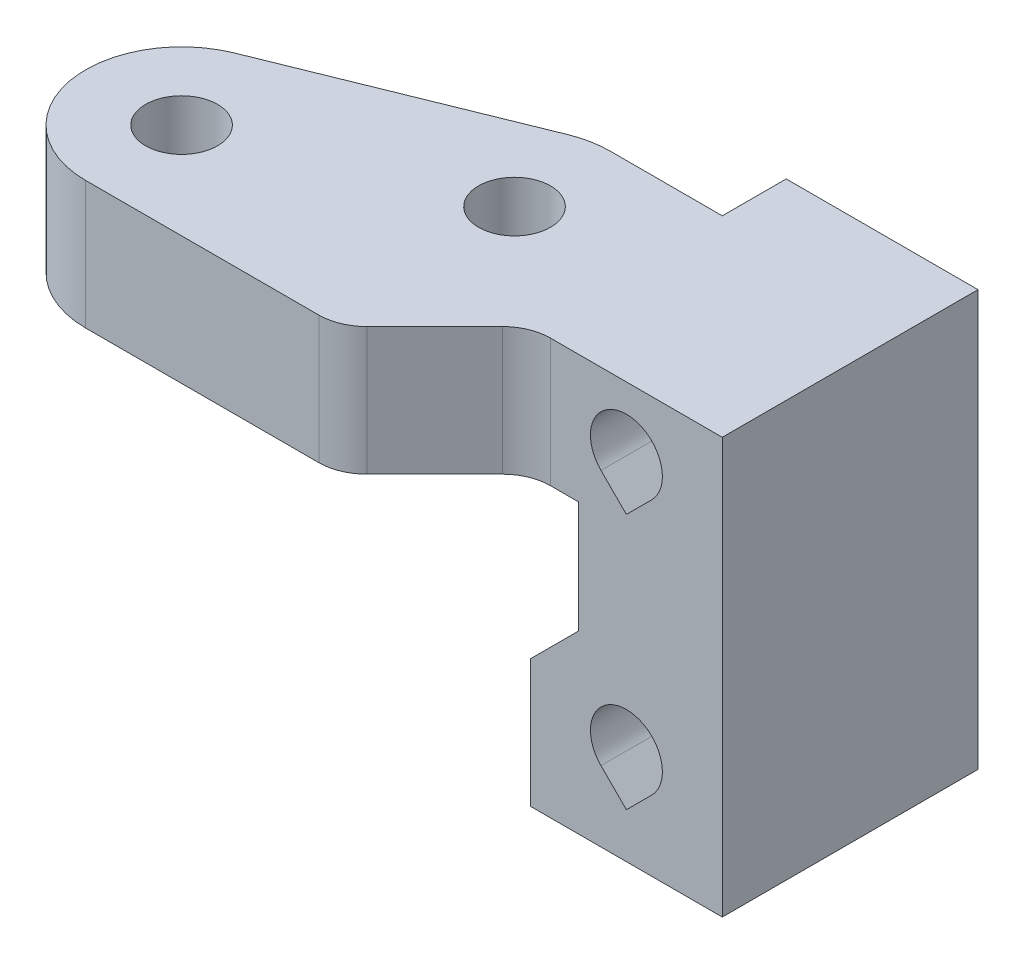
ISO-10303-21;
HEADER;
FILE_DESCRIPTION(('STEP AP214'),'2;1');
FILE_NAME('part.step','',(''),(''),'','','');
FILE_SCHEMA(('AUTOMOTIVE_DESIGN { 1 0 10303 214 1 1 1 1 }'));
ENDSEC;
DATA;
#1=APPLICATION_CONTEXT('core data for automotive mechanical design processes');
#2=APPLICATION_PROTOCOL_DEFINITION('international standard','automotive_design',2000,#1);
#3=PRODUCT_CONTEXT('',#1,'mechanical');
#4=PRODUCT('Part','Part','',(#3));
#5=PRODUCT_RELATED_PRODUCT_CATEGORY('part','',(#4));
#6=PRODUCT_DEFINITION_FORMATION('','',#4);
#7=PRODUCT_DEFINITION_CONTEXT('part definition',#1,'design');
#8=PRODUCT_DEFINITION('design','',#6,#7);
#9=PRODUCT_DEFINITION_SHAPE('','',#8);
#10=(LENGTH_UNIT() NAMED_UNIT(*) SI_UNIT(.MILLI.,.METRE.));
#11=(NAMED_UNIT(*) PLANE_ANGLE_UNIT() SI_UNIT($,.RADIAN.));
#12=(NAMED_UNIT(*) SI_UNIT($,.STERADIAN.) SOLID_ANGLE_UNIT());
#13=UNCERTAINTY_MEASURE_WITH_UNIT(LENGTH_MEASURE(1.E-05),#10,'distance_accuracy_value','');
#14=(GEOMETRIC_REPRESENTATION_CONTEXT(3) GLOBAL_UNCERTAINTY_ASSIGNED_CONTEXT((#13)) GLOBAL_UNIT_ASSIGNED_CONTEXT((#10,
#11,#12)) REPRESENTATION_CONTEXT('',''));
#15=CARTESIAN_POINT('',(0.,0.,0.));
#16=DIRECTION('',(0.,0.,1.));
#17=DIRECTION('',(1.,0.,0.));
#18=AXIS2_PLACEMENT_3D('',#15,#16,#17);
#19=CARTESIAN_POINT('',(-12.,8.,0.));
#20=DIRECTION('',(1.,0.,0.));
#21=DIRECTION('',(0.,0.,-1.));
#22=AXIS2_PLACEMENT_3D('',#19,#20,#21);
#23=PLANE('',#22);
#24=DIRECTION('',(0.,-1.,0.));
#25=VECTOR('',#24,1.);
#26=CARTESIAN_POINT('',(-12.,8.,0.));
#27=LINE('',#26,#25);
#28=CARTESIAN_POINT('',(-12.,8.,0.));
#29=VERTEX_POINT('',#28);
#30=CARTESIAN_POINT('',(-12.,0.,0.));
#31=VERTEX_POINT('',#30);
#32=EDGE_CURVE('E436',#29,#31,#27,.T.);
#33=ORIENTED_EDGE('',*,*,#32,.T.);
#34=DIRECTION('',(0.,0.,1.));
#35=VECTOR('',#34,1.);
#36=CARTESIAN_POINT('',(-12.,0.,0.));
#37=LINE('',#36,#35);
#38=CARTESIAN_POINT('',(-12.,0.,4.));
#39=VERTEX_POINT('',#38);
#40=EDGE_CURVE('E311',#31,#39,#37,.T.);
#41=ORIENTED_EDGE('',*,*,#40,.T.);
#42=DIRECTION('',(0.,-1.,0.));
#43=VECTOR('',#42,1.);
#44=CARTESIAN_POINT('',(-12.,8.,4.));
#45=LINE('',#44,#43);
#46=CARTESIAN_POINT('',(-12.,8.,4.));
#47=VERTEX_POINT('',#46);
#48=EDGE_CURVE('E245',#47,#39,#45,.T.);
#49=ORIENTED_EDGE('',*,*,#48,.F.);
#50=DIRECTION('',(0.,0.,1.));
#51=VECTOR('',#50,1.);
#52=CARTESIAN_POINT('',(-12.,8.,0.));
#53=LINE('',#52,#51);
#54=EDGE_CURVE('E213',#29,#47,#53,.T.);
#55=ORIENTED_EDGE('',*,*,#54,.F.);
#56=EDGE_LOOP('',(#33,#41,#49,#55));
#57=FACE_BOUND('',#56,.T.);
#58=ADVANCED_FACE('F32',(#57),#23,.F.);
#59=CARTESIAN_POINT('',(-19.,0.,10.));
#60=DIRECTION('',(0.,1.,0.));
#61=DIRECTION('',(0.,0.,1.));
#62=AXIS2_PLACEMENT_3D('',#59,#60,#61);
#63=PLANE('',#62);
#64=CARTESIAN_POINT('',(-33.8323969741913,0.,16.));
#65=DIRECTION('',(0.,1.,0.));
#66=DIRECTION('',(0.,0.,1.));
#67=AXIS2_PLACEMENT_3D('',#64,#65,#66);
#68=CIRCLE('',#67,2.25);
#69=CARTESIAN_POINT('',(-33.8323969741913,0.,18.25));
#70=VERTEX_POINT('',#69);
#71=EDGE_CURVE('E354',#70,#70,#68,.T.);
#72=ORIENTED_EDGE('',*,*,#71,.T.);
#73=EDGE_LOOP('',(#72));
#74=FACE_BOUND('',#73,.T.);
#75=CARTESIAN_POINT('',(-19.,0.,10.));
#76=DIRECTION('',(0.,1.,0.));
#77=DIRECTION('',(0.,0.,1.));
#78=AXIS2_PLACEMENT_3D('',#75,#76,#77);
#79=CIRCLE('',#78,2.25);
#80=CARTESIAN_POINT('',(-19.,0.,12.25));
#81=VERTEX_POINT('',#80);
#82=EDGE_CURVE('E218',#81,#81,#79,.T.);
#83=ORIENTED_EDGE('',*,*,#82,.T.);
#84=EDGE_LOOP('',(#83));
#85=FACE_BOUND('',#84,.T.);
#86=DIRECTION('',(0.707106781186549,0.,-0.707106781186546));
#87=VECTOR('',#86,1.);
#88=CARTESIAN_POINT('',(-12.,0.,16.));
#89=LINE('',#88,#87);
#90=CARTESIAN_POINT('',(-12.8786796564404,0.,16.8786796564404));
#91=VERTEX_POINT('',#90);
#92=CARTESIAN_POINT('',(-17.1213203435597,0.,21.1213203435596));
#93=VERTEX_POINT('',#92);
#94=EDGE_CURVE('E259',#91,#93,#89,.F.);
#95=ORIENTED_EDGE('',*,*,#94,.T.);
#96=CARTESIAN_POINT('',(-19.2426406871193,0.,19.));
#97=DIRECTION('',(0.,1.,0.));
#98=DIRECTION('',(0.,0.,1.));
#99=AXIS2_PLACEMENT_3D('',#96,#97,#98);
#100=CIRCLE('',#99,3.);
#101=CARTESIAN_POINT('',(-19.2426406871193,0.,22.));
#102=VERTEX_POINT('',#101);
#103=EDGE_CURVE('E55',#93,#102,#100,.F.);
#104=ORIENTED_EDGE('',*,*,#103,.T.);
#105=DIRECTION('',(1.,0.,0.));
#106=VECTOR('',#105,1.);
#107=CARTESIAN_POINT('',(-33.8323969741913,0.,22.));
#108=LINE('',#107,#106);
#109=CARTESIAN_POINT('',(-33.8323969741913,0.,22.));
#110=VERTEX_POINT('',#109);
#111=EDGE_CURVE('E211',#110,#102,#108,.T.);
#112=ORIENTED_EDGE('',*,*,#111,.F.);
#113=CARTESIAN_POINT('',(-33.8323969741913,0.,16.));
#114=DIRECTION('',(0.,1.,0.));
#115=DIRECTION('',(0.,0.,1.));
#116=AXIS2_PLACEMENT_3D('',#113,#114,#115);
#117=CIRCLE('',#116,6.);
#118=CARTESIAN_POINT('',(-36.0823969741913,0.,10.4378511346783));
#119=VERTEX_POINT('',#118);
#120=EDGE_CURVE('E215',#119,#110,#117,.T.);
#121=ORIENTED_EDGE('',*,*,#120,.F.);
#122=DIRECTION('',(-0.927024810886958,0.,0.375));
#123=VECTOR('',#122,1.);
#124=CARTESIAN_POINT('',(-21.25,0.,4.43785113467826));
#125=LINE('',#124,#123);
#126=CARTESIAN_POINT('',(-21.25,0.,4.43785113467825));
#127=VERTEX_POINT('',#126);
#128=EDGE_CURVE('E235',#127,#119,#125,.T.);
#129=ORIENTED_EDGE('',*,*,#128,.F.);
#130=CARTESIAN_POINT('',(-19.,0.,10.));
#131=DIRECTION('',(0.,1.,0.));
#132=DIRECTION('',(0.,0.,1.));
#133=AXIS2_PLACEMENT_3D('',#130,#131,#132);
#134=CIRCLE('',#133,6.);
#135=CARTESIAN_POINT('',(-19.,0.,4.));
#136=VERTEX_POINT('',#135);
#137=EDGE_CURVE('E233',#136,#127,#134,.T.);
#138=ORIENTED_EDGE('',*,*,#137,.F.);
#139=DIRECTION('',(-1.,0.,0.));
#140=VECTOR('',#139,1.);
#141=CARTESIAN_POINT('',(-12.,0.,4.));
#142=LINE('',#141,#140);
#143=EDGE_CURVE('E236',#39,#136,#142,.T.);
#144=ORIENTED_EDGE('',*,*,#143,.F.);
#145=ORIENTED_EDGE('',*,*,#40,.F.);
#146=DIRECTION('',(-1.,0.,0.));
#147=VECTOR('',#146,1.);
#148=CARTESIAN_POINT('',(-9.,0.,0.));
#149=LINE('',#148,#147);
#150=CARTESIAN_POINT('',(-9.,0.,0.));
#151=VERTEX_POINT('',#150);
#152=EDGE_CURVE('E296',#151,#31,#149,.T.);
#153=ORIENTED_EDGE('',*,*,#152,.F.);
#154=DIRECTION('',(0.,0.,1.));
#155=VECTOR('',#154,1.);
#156=CARTESIAN_POINT('',(-9.,0.,0.));
#157=LINE('',#156,#155);
#158=CARTESIAN_POINT('',(-9.,0.,16.));
#159=VERTEX_POINT('',#158);
#160=EDGE_CURVE('E291',#151,#159,#157,.T.);
#161=ORIENTED_EDGE('',*,*,#160,.T.);
#162=DIRECTION('',(-1.,0.,0.));
#163=VECTOR('',#162,1.);
#164=CARTESIAN_POINT('',(-19.,0.,16.));
#165=LINE('',#164,#163);
#166=CARTESIAN_POINT('',(-10.7573593128807,0.,16.));
#167=VERTEX_POINT('',#166);
#168=EDGE_CURVE('E276',#159,#167,#165,.T.);
#169=ORIENTED_EDGE('',*,*,#168,.T.);
#170=CARTESIAN_POINT('',(-10.7573593128807,0.,19.));
#171=DIRECTION('',(0.,1.,0.));
#172=DIRECTION('',(0.,0.,1.));
#173=AXIS2_PLACEMENT_3D('',#170,#171,#172);
#174=CIRCLE('',#173,3.);
#175=EDGE_CURVE('E40',#167,#91,#174,.T.);
#176=ORIENTED_EDGE('',*,*,#175,.T.);
#177=EDGE_LOOP('',(#95,#104,#112,#121,#129,#138,#144,#145,#153,#161,#169,#176));
#178=FACE_BOUND('',#177,.T.);
#179=ADVANCED_FACE('F274',(#74,#85,#178),#63,.F.);
#180=CARTESIAN_POINT('',(-19.,8.,10.));
#181=DIRECTION('',(0.,1.,0.));
#182=DIRECTION('',(0.,0.,1.));
#183=AXIS2_PLACEMENT_3D('',#180,#181,#182);
#184=PLANE('',#183);
#185=DIRECTION('',(1.,0.,0.));
#186=VECTOR('',#185,1.);
#187=CARTESIAN_POINT('',(-33.8323969741913,8.,22.));
#188=LINE('',#187,#186);
#189=CARTESIAN_POINT('',(-33.8323969741913,8.,22.));
#190=VERTEX_POINT('',#189);
#191=CARTESIAN_POINT('',(-19.2426406871193,8.,22.));
#192=VERTEX_POINT('',#191);
#193=EDGE_CURVE('E230',#190,#192,#188,.T.);
#194=ORIENTED_EDGE('',*,*,#193,.T.);
#195=CARTESIAN_POINT('',(-19.2426406871193,8.,19.));
#196=DIRECTION('',(0.,1.,0.));
#197=DIRECTION('',(0.,0.,1.));
#198=AXIS2_PLACEMENT_3D('',#195,#196,#197);
#199=CIRCLE('',#198,3.);
#200=CARTESIAN_POINT('',(-17.1213203435597,8.,21.1213203435596));
#201=VERTEX_POINT('',#200);
#202=EDGE_CURVE('E47',#192,#201,#199,.T.);
#203=ORIENTED_EDGE('',*,*,#202,.T.);
#204=DIRECTION('',(-0.707106781186549,0.,0.707106781186546));
#205=VECTOR('',#204,1.);
#206=CARTESIAN_POINT('',(-12.5,8.,16.5));
#207=LINE('',#206,#205);
#208=CARTESIAN_POINT('',(-12.8786796564404,8.,16.8786796564404));
#209=VERTEX_POINT('',#208);
#210=EDGE_CURVE('E261',#201,#209,#207,.F.);
#211=ORIENTED_EDGE('',*,*,#210,.T.);
#212=CARTESIAN_POINT('',(-10.7573593128807,8.,19.));
#213=DIRECTION('',(0.,1.,0.));
#214=DIRECTION('',(0.,0.,1.));
#215=AXIS2_PLACEMENT_3D('',#212,#213,#214);
#216=CIRCLE('',#215,3.);
#217=CARTESIAN_POINT('',(-10.7573593128807,8.,16.));
#218=VERTEX_POINT('',#217);
#219=EDGE_CURVE('E11',#209,#218,#216,.F.);
#220=ORIENTED_EDGE('',*,*,#219,.T.);
#221=DIRECTION('',(-1.,0.,0.));
#222=VECTOR('',#221,1.);
#223=CARTESIAN_POINT('',(0.,8.,16.));
#224=LINE('',#223,#222);
#225=CARTESIAN_POINT('',(0.,8.,16.));
#226=VERTEX_POINT('',#225);
#227=EDGE_CURVE('E188',#226,#218,#224,.T.);
#228=ORIENTED_EDGE('',*,*,#227,.F.);
#229=DIRECTION('',(0.,0.,-1.));
#230=VECTOR('',#229,1.);
#231=CARTESIAN_POINT('',(0.,8.,22.));
#232=LINE('',#231,#230);
#233=CARTESIAN_POINT('',(0.,8.,0.));
#234=VERTEX_POINT('',#233);
#235=EDGE_CURVE('E201',#226,#234,#232,.T.);
#236=ORIENTED_EDGE('',*,*,#235,.T.);
#237=DIRECTION('',(-1.,0.,0.));
#238=VECTOR('',#237,1.);
#239=CARTESIAN_POINT('',(0.,8.,0.));
#240=LINE('',#239,#238);
#241=EDGE_CURVE('E210',#234,#29,#240,.T.);
#242=ORIENTED_EDGE('',*,*,#241,.T.);
#243=ORIENTED_EDGE('',*,*,#54,.T.);
#244=DIRECTION('',(-1.,0.,0.));
#245=VECTOR('',#244,1.);
#246=CARTESIAN_POINT('',(-12.,8.,4.));
#247=LINE('',#246,#245);
#248=CARTESIAN_POINT('',(-19.,8.,4.));
#249=VERTEX_POINT('',#248);
#250=EDGE_CURVE('E222',#47,#249,#247,.T.);
#251=ORIENTED_EDGE('',*,*,#250,.T.);
#252=CARTESIAN_POINT('',(-19.,8.,10.));
#253=DIRECTION('',(0.,1.,0.));
#254=DIRECTION('',(0.,0.,1.));
#255=AXIS2_PLACEMENT_3D('',#252,#253,#254);
#256=CIRCLE('',#255,6.);
#257=CARTESIAN_POINT('',(-21.25,8.,4.43785113467825));
#258=VERTEX_POINT('',#257);
#259=EDGE_CURVE('E224',#249,#258,#256,.T.);
#260=ORIENTED_EDGE('',*,*,#259,.T.);
#261=DIRECTION('',(-0.927024810886958,0.,0.375));
#262=VECTOR('',#261,1.);
#263=CARTESIAN_POINT('',(-21.25,8.,4.43785113467826));
#264=LINE('',#263,#262);
#265=CARTESIAN_POINT('',(-36.0823969741913,8.,10.4378511346783));
#266=VERTEX_POINT('',#265);
#267=EDGE_CURVE('E226',#258,#266,#264,.T.);
#268=ORIENTED_EDGE('',*,*,#267,.T.);
#269=CARTESIAN_POINT('',(-33.8323969741913,8.,16.));
#270=DIRECTION('',(0.,1.,0.));
#271=DIRECTION('',(0.,0.,1.));
#272=AXIS2_PLACEMENT_3D('',#269,#270,#271);
#273=CIRCLE('',#272,6.);
#274=EDGE_CURVE('E228',#266,#190,#273,.T.);
#275=ORIENTED_EDGE('',*,*,#274,.T.);
#276=EDGE_LOOP('',(#194,#203,#211,#220,#228,#236,#242,#243,#251,#260,#268,#275));
#277=FACE_BOUND('',#276,.T.);
#278=CARTESIAN_POINT('',(-19.,8.,10.));
#279=DIRECTION('',(0.,1.,0.));
#280=DIRECTION('',(0.,0.,1.));
#281=AXIS2_PLACEMENT_3D('',#278,#279,#280);
#282=CIRCLE('',#281,2.25);
#283=CARTESIAN_POINT('',(-19.,8.,12.25));
#284=VERTEX_POINT('',#283);
#285=EDGE_CURVE('E253',#284,#284,#282,.T.);
#286=ORIENTED_EDGE('',*,*,#285,.F.);
#287=EDGE_LOOP('',(#286));
#288=FACE_BOUND('',#287,.T.);
#289=CARTESIAN_POINT('',(-33.8323969741913,8.,16.));
#290=DIRECTION('',(0.,1.,0.));
#291=DIRECTION('',(0.,0.,1.));
#292=AXIS2_PLACEMENT_3D('',#289,#290,#291);
#293=CIRCLE('',#292,2.25);
#294=CARTESIAN_POINT('',(-33.8323969741913,8.,18.25));
#295=VERTEX_POINT('',#294);
#296=EDGE_CURVE('E355',#295,#295,#293,.T.);
#297=ORIENTED_EDGE('',*,*,#296,.F.);
#298=EDGE_LOOP('',(#297));
#299=FACE_BOUND('',#298,.T.);
#300=ADVANCED_FACE('F199',(#277,#288,#299),#184,.T.);
#301=CARTESIAN_POINT('',(0.,8.,22.));
#302=DIRECTION('',(-1.,0.,0.));
#303=DIRECTION('',(0.,0.,1.));
#304=AXIS2_PLACEMENT_3D('',#301,#302,#303);
#305=PLANE('',#304);
#306=ORIENTED_EDGE('',*,*,#235,.F.);
#307=DIRECTION('',(0.,1.,0.));
#308=VECTOR('',#307,1.);
#309=CARTESIAN_POINT('',(0.,8.,16.));
#310=LINE('',#309,#308);
#311=CARTESIAN_POINT('',(0.,-18.,16.));
#312=VERTEX_POINT('',#311);
#313=EDGE_CURVE('E183',#312,#226,#310,.T.);
#314=ORIENTED_EDGE('',*,*,#313,.F.);
#315=DIRECTION('',(0.,0.,1.));
#316=VECTOR('',#315,1.);
#317=CARTESIAN_POINT('',(0.,-18.,0.));
#318=LINE('',#317,#316);
#319=CARTESIAN_POINT('',(0.,-18.,0.));
#320=VERTEX_POINT('',#319);
#321=EDGE_CURVE('E352',#320,#312,#318,.T.);
#322=ORIENTED_EDGE('',*,*,#321,.F.);
#323=DIRECTION('',(0.,-1.,0.));
#324=VECTOR('',#323,1.);
#325=CARTESIAN_POINT('',(0.,8.,0.));
#326=LINE('',#325,#324);
#327=EDGE_CURVE('E209',#234,#320,#326,.T.);
#328=ORIENTED_EDGE('',*,*,#327,.F.);
#329=EDGE_LOOP('',(#306,#314,#322,#328));
#330=FACE_BOUND('',#329,.T.);
#331=ADVANCED_FACE('F208',(#330),#305,.F.);
#332=CARTESIAN_POINT('',(0.,8.,0.));
#333=DIRECTION('',(0.,0.,1.));
#334=DIRECTION('',(1.,0.,0.));
#335=AXIS2_PLACEMENT_3D('',#332,#333,#334);
#336=PLANE('',#335);
#337=DIRECTION('',(0.707106781186548,0.707106781186547,0.));
#338=VECTOR('',#337,1.);
#339=CARTESIAN_POINT('',(-6.,-15.1819805153395,0.));
#340=LINE('',#339,#338);
#341=CARTESIAN_POINT('',(-6.,-15.1819805153395,0.));
#342=VERTEX_POINT('',#341);
#343=CARTESIAN_POINT('',(-4.40900974233027,-13.5909902576697,0.));
#344=VERTEX_POINT('',#343);
#345=EDGE_CURVE('E317',#342,#344,#340,.T.);
#346=ORIENTED_EDGE('',*,*,#345,.T.);
#347=CARTESIAN_POINT('',(-6.,-12.,0.));
#348=DIRECTION('',(0.,0.,1.));
#349=DIRECTION('',(1.,0.,0.));
#350=AXIS2_PLACEMENT_3D('',#347,#348,#349);
#351=CIRCLE('',#350,2.25);
#352=CARTESIAN_POINT('',(-7.59099025766974,-13.5909902576697,0.));
#353=VERTEX_POINT('',#352);
#354=EDGE_CURVE('E298',#344,#353,#351,.T.);
#355=ORIENTED_EDGE('',*,*,#354,.T.);
#356=DIRECTION('',(0.707106781186548,-0.707106781186547,0.));
#357=VECTOR('',#356,1.);
#358=CARTESIAN_POINT('',(-7.59099025766974,-13.5909902576697,0.));
#359=LINE('',#358,#357);
#360=EDGE_CURVE('E301',#353,#342,#359,.T.);
#361=ORIENTED_EDGE('',*,*,#360,.T.);
#362=EDGE_LOOP('',(#346,#355,#361));
#363=FACE_BOUND('',#362,.T.);
#364=DIRECTION('',(0.707106781186547,0.707106781186548,0.));
#365=VECTOR('',#364,1.);
#366=CARTESIAN_POINT('',(-6.,0.818019484660536,0.));
#367=LINE('',#366,#365);
#368=CARTESIAN_POINT('',(-6.,0.818019484660536,0.));
#369=VERTEX_POINT('',#368);
#370=CARTESIAN_POINT('',(-4.40900974233027,2.40900974233027,0.));
#371=VERTEX_POINT('',#370);
#372=EDGE_CURVE('E335',#369,#371,#367,.T.);
#373=ORIENTED_EDGE('',*,*,#372,.T.);
#374=CARTESIAN_POINT('',(-6.,4.,0.));
#375=DIRECTION('',(0.,0.,1.));
#376=DIRECTION('',(1.,0.,0.));
#377=AXIS2_PLACEMENT_3D('',#374,#375,#376);
#378=CIRCLE('',#377,2.25);
#379=CARTESIAN_POINT('',(-7.59099025766973,2.40900974233027,0.));
#380=VERTEX_POINT('',#379);
#381=EDGE_CURVE('E324',#371,#380,#378,.T.);
#382=ORIENTED_EDGE('',*,*,#381,.T.);
#383=DIRECTION('',(0.707106781186548,-0.707106781186547,0.));
#384=VECTOR('',#383,1.);
#385=CARTESIAN_POINT('',(-7.59099025766973,2.40900974233027,0.));
#386=LINE('',#385,#384);
#387=EDGE_CURVE('E332',#380,#369,#386,.T.);
#388=ORIENTED_EDGE('',*,*,#387,.T.);
#389=EDGE_LOOP('',(#373,#382,#388));
#390=FACE_BOUND('',#389,.T.);
#391=DIRECTION('',(0.,1.,0.));
#392=VECTOR('',#391,1.);
#393=CARTESIAN_POINT('',(-9.,-6.99999999999997,0.));
#394=LINE('',#393,#392);
#395=CARTESIAN_POINT('',(-9.,-6.99999999999997,0.));
#396=VERTEX_POINT('',#395);
#397=EDGE_CURVE('E306',#396,#151,#394,.T.);
#398=ORIENTED_EDGE('',*,*,#397,.T.);
#399=ORIENTED_EDGE('',*,*,#152,.T.);
#400=ORIENTED_EDGE('',*,*,#32,.F.);
#401=ORIENTED_EDGE('',*,*,#241,.F.);
#402=ORIENTED_EDGE('',*,*,#327,.T.);
#403=DIRECTION('',(1.,0.,0.));
#404=VECTOR('',#403,1.);
#405=CARTESIAN_POINT('',(-12.,-18.,0.));
#406=LINE('',#405,#404);
#407=CARTESIAN_POINT('',(-12.,-18.,0.));
#408=VERTEX_POINT('',#407);
#409=EDGE_CURVE('E349',#408,#320,#406,.T.);
#410=ORIENTED_EDGE('',*,*,#409,.F.);
#411=CARTESIAN_POINT('',(-12.,-10.,0.));
#412=VERTEX_POINT('',#411);
#413=EDGE_CURVE('E248',#412,#408,#27,.T.);
#414=ORIENTED_EDGE('',*,*,#413,.F.);
#415=DIRECTION('',(0.707106781186543,0.707106781186552,0.));
#416=VECTOR('',#415,1.);
#417=CARTESIAN_POINT('',(-12.,-10.,0.));
#418=LINE('',#417,#416);
#419=EDGE_CURVE('E432',#412,#396,#418,.T.);
#420=ORIENTED_EDGE('',*,*,#419,.T.);
#421=EDGE_LOOP('',(#398,#399,#400,#401,#402,#410,#414,#420));
#422=FACE_BOUND('',#421,.T.);
#423=ADVANCED_FACE('F396',(#363,#390,#422),#336,.F.);
#424=DIRECTION('',(0.,0.,-1.));
#425=VECTOR('',#424,1.);
#426=CARTESIAN_POINT('',(-12.,-18.,0.));
#427=LINE('',#426,#425);
#428=CARTESIAN_POINT('',(-12.,-18.,16.));
#429=VERTEX_POINT('',#428);
#430=EDGE_CURVE('E342',#429,#408,#427,.T.);
#431=ORIENTED_EDGE('',*,*,#430,.F.);
#432=DIRECTION('',(0.,-1.,0.));
#433=VECTOR('',#432,1.);
#434=CARTESIAN_POINT('',(-12.,8.,16.));
#435=LINE('',#434,#433);
#436=CARTESIAN_POINT('',(-12.,-10.,16.));
#437=VERTEX_POINT('',#436);
#438=EDGE_CURVE('E205',#437,#429,#435,.T.);
#439=ORIENTED_EDGE('',*,*,#438,.F.);
#440=DIRECTION('',(0.,0.,1.));
#441=VECTOR('',#440,1.);
#442=CARTESIAN_POINT('',(-12.,-10.,0.));
#443=LINE('',#442,#441);
#444=EDGE_CURVE('E303',#412,#437,#443,.T.);
#445=ORIENTED_EDGE('',*,*,#444,.F.);
#446=ORIENTED_EDGE('',*,*,#413,.T.);
#447=EDGE_LOOP('',(#431,#439,#445,#446));
#448=FACE_BOUND('',#447,.T.);
#449=ADVANCED_FACE('F385',(#448),#23,.F.);
#450=CARTESIAN_POINT('',(-12.,8.,4.));
#451=DIRECTION('',(0.,0.,1.));
#452=DIRECTION('',(1.,0.,0.));
#453=AXIS2_PLACEMENT_3D('',#450,#451,#452);
#454=PLANE('',#453);
#455=ORIENTED_EDGE('',*,*,#143,.T.);
#456=DIRECTION('',(0.,-1.,0.));
#457=VECTOR('',#456,1.);
#458=CARTESIAN_POINT('',(-19.,8.,4.));
#459=LINE('',#458,#457);
#460=EDGE_CURVE('E249',#249,#136,#459,.T.);
#461=ORIENTED_EDGE('',*,*,#460,.F.);
#462=ORIENTED_EDGE('',*,*,#250,.F.);
#463=ORIENTED_EDGE('',*,*,#48,.T.);
#464=EDGE_LOOP('',(#455,#461,#462,#463));
#465=FACE_BOUND('',#464,.T.);
#466=ADVANCED_FACE('F395',(#465),#454,.F.);
#467=CARTESIAN_POINT('',(-19.,8.,10.));
#468=DIRECTION('',(0.,-1.,0.));
#469=DIRECTION('',(0.,0.,-1.));
#470=AXIS2_PLACEMENT_3D('',#467,#468,#469);
#471=CYLINDRICAL_SURFACE('',#470,6.);
#472=ORIENTED_EDGE('',*,*,#137,.T.);
#473=DIRECTION('',(0.,-1.,0.));
#474=VECTOR('',#473,1.);
#475=CARTESIAN_POINT('',(-21.25,8.,4.43785113467825));
#476=LINE('',#475,#474);
#477=EDGE_CURVE('E442',#258,#127,#476,.T.);
#478=ORIENTED_EDGE('',*,*,#477,.F.);
#479=ORIENTED_EDGE('',*,*,#259,.F.);
#480=ORIENTED_EDGE('',*,*,#460,.T.);
#481=EDGE_LOOP('',(#472,#478,#479,#480));
#482=FACE_BOUND('',#481,.T.);
#483=ADVANCED_FACE('F402',(#482),#471,.T.);
#484=CARTESIAN_POINT('',(-21.25,8.,4.43785113467826));
#485=DIRECTION('',(0.375,0.,0.927024810886958));
#486=DIRECTION('',(0.927024810886958,0.,-0.375));
#487=AXIS2_PLACEMENT_3D('',#484,#485,#486);
#488=PLANE('',#487);
#489=ORIENTED_EDGE('',*,*,#128,.T.);
#490=DIRECTION('',(0.,-1.,0.));
#491=VECTOR('',#490,1.);
#492=CARTESIAN_POINT('',(-36.0823969741913,8.,10.4378511346783));
#493=LINE('',#492,#491);
#494=EDGE_CURVE('E444',#266,#119,#493,.T.);
#495=ORIENTED_EDGE('',*,*,#494,.F.);
#496=ORIENTED_EDGE('',*,*,#267,.F.);
#497=ORIENTED_EDGE('',*,*,#477,.T.);
#498=EDGE_LOOP('',(#489,#495,#496,#497));
#499=FACE_BOUND('',#498,.T.);
#500=ADVANCED_FACE('F456',(#499),#488,.F.);
#501=CARTESIAN_POINT('',(-33.8323969741913,8.,16.));
#502=DIRECTION('',(0.,-1.,0.));
#503=DIRECTION('',(0.,0.,-1.));
#504=AXIS2_PLACEMENT_3D('',#501,#502,#503);
#505=CYLINDRICAL_SURFACE('',#504,6.);
#506=ORIENTED_EDGE('',*,*,#120,.T.);
#507=DIRECTION('',(0.,-1.,0.));
#508=VECTOR('',#507,1.);
#509=CARTESIAN_POINT('',(-33.8323969741913,8.,22.));
#510=LINE('',#509,#508);
#511=EDGE_CURVE('E232',#190,#110,#510,.T.);
#512=ORIENTED_EDGE('',*,*,#511,.F.);
#513=ORIENTED_EDGE('',*,*,#274,.F.);
#514=ORIENTED_EDGE('',*,*,#494,.T.);
#515=EDGE_LOOP('',(#506,#512,#513,#514));
#516=FACE_BOUND('',#515,.T.);
#517=ADVANCED_FACE('F378',(#516),#505,.T.);
#518=CARTESIAN_POINT('',(-33.8323969741913,8.,22.));
#519=DIRECTION('',(0.,0.,-1.));
#520=DIRECTION('',(-1.,0.,0.));
#521=AXIS2_PLACEMENT_3D('',#518,#519,#520);
#522=PLANE('',#521);
#523=ORIENTED_EDGE('',*,*,#111,.T.);
#524=DIRECTION('',(0.,-1.,0.));
#525=VECTOR('',#524,1.);
#526=CARTESIAN_POINT('',(-19.2426406871193,8.,22.));
#527=LINE('',#526,#525);
#528=EDGE_CURVE('E269',#102,#192,#527,.F.);
#529=ORIENTED_EDGE('',*,*,#528,.T.);
#530=ORIENTED_EDGE('',*,*,#193,.F.);
#531=ORIENTED_EDGE('',*,*,#511,.T.);
#532=EDGE_LOOP('',(#523,#529,#530,#531));
#533=FACE_BOUND('',#532,.T.);
#534=ADVANCED_FACE('F369',(#533),#522,.F.);
#535=CARTESIAN_POINT('',(-19.,8.,10.));
#536=DIRECTION('',(0.,-1.,0.));
#537=DIRECTION('',(0.,0.,-1.));
#538=AXIS2_PLACEMENT_3D('',#535,#536,#537);
#539=CYLINDRICAL_SURFACE('',#538,2.25);
#540=ORIENTED_EDGE('',*,*,#285,.T.);
#541=EDGE_LOOP('',(#540));
#542=FACE_BOUND('',#541,.T.);
#543=ORIENTED_EDGE('',*,*,#82,.F.);
#544=EDGE_LOOP('',(#543));
#545=FACE_BOUND('',#544,.T.);
#546=ADVANCED_FACE('F366',(#542,#545),#539,.F.);
#547=CARTESIAN_POINT('',(-33.8323969741913,8.,16.));
#548=DIRECTION('',(0.,-1.,0.));
#549=DIRECTION('',(0.,0.,-1.));
#550=AXIS2_PLACEMENT_3D('',#547,#548,#549);
#551=CYLINDRICAL_SURFACE('',#550,2.25);
#552=ORIENTED_EDGE('',*,*,#296,.T.);
#553=EDGE_LOOP('',(#552));
#554=FACE_BOUND('',#553,.T.);
#555=ORIENTED_EDGE('',*,*,#71,.F.);
#556=EDGE_LOOP('',(#555));
#557=FACE_BOUND('',#556,.T.);
#558=ADVANCED_FACE('F368',(#554,#557),#551,.F.);
#559=CARTESIAN_POINT('',(0.,-18.,0.));
#560=DIRECTION('',(0.,1.,0.));
#561=DIRECTION('',(0.,0.,1.));
#562=AXIS2_PLACEMENT_3D('',#559,#560,#561);
#563=PLANE('',#562);
#564=ORIENTED_EDGE('',*,*,#321,.T.);
#565=DIRECTION('',(1.,0.,0.));
#566=VECTOR('',#565,1.);
#567=CARTESIAN_POINT('',(0.,-18.,16.));
#568=LINE('',#567,#566);
#569=EDGE_CURVE('E191',#429,#312,#568,.T.);
#570=ORIENTED_EDGE('',*,*,#569,.F.);
#571=ORIENTED_EDGE('',*,*,#430,.T.);
#572=ORIENTED_EDGE('',*,*,#409,.T.);
#573=EDGE_LOOP('',(#564,#570,#571,#572));
#574=FACE_BOUND('',#573,.T.);
#575=ADVANCED_FACE('F375',(#574),#563,.F.);
#576=CARTESIAN_POINT('',(-6.,4.,0.));
#577=DIRECTION('',(0.,0.,1.));
#578=DIRECTION('',(1.,0.,0.));
#579=AXIS2_PLACEMENT_3D('',#576,#577,#578);
#580=CYLINDRICAL_SURFACE('',#579,2.25);
#581=DIRECTION('',(0.,0.,1.));
#582=VECTOR('',#581,1.);
#583=CARTESIAN_POINT('',(-4.40900974233027,2.40900974233027,0.));
#584=LINE('',#583,#582);
#585=CARTESIAN_POINT('',(-4.40900974233027,2.40900974233027,16.));
#586=VERTEX_POINT('',#585);
#587=EDGE_CURVE('E339',#371,#586,#584,.T.);
#588=ORIENTED_EDGE('',*,*,#587,.T.);
#589=CARTESIAN_POINT('',(-6.,4.,16.));
#590=DIRECTION('',(0.,0.,-1.));
#591=DIRECTION('',(-1.,0.,0.));
#592=AXIS2_PLACEMENT_3D('',#589,#590,#591);
#593=CIRCLE('',#592,2.25);
#594=CARTESIAN_POINT('',(-7.59099025766973,2.40900974233027,16.));
#595=VERTEX_POINT('',#594);
#596=EDGE_CURVE('E429',#586,#595,#593,.F.);
#597=ORIENTED_EDGE('',*,*,#596,.T.);
#598=DIRECTION('',(0.,0.,1.));
#599=VECTOR('',#598,1.);
#600=CARTESIAN_POINT('',(-7.59099025766973,2.40900974233027,0.));
#601=LINE('',#600,#599);
#602=EDGE_CURVE('E338',#380,#595,#601,.T.);
#603=ORIENTED_EDGE('',*,*,#602,.F.);
#604=ORIENTED_EDGE('',*,*,#381,.F.);
#605=EDGE_LOOP('',(#588,#597,#603,#604));
#606=FACE_BOUND('',#605,.T.);
#607=ADVANCED_FACE('F567',(#606),#580,.F.);
#608=CARTESIAN_POINT('',(-6.,0.818019484660536,0.));
#609=DIRECTION('',(0.707106781186548,-0.707106781186547,0.));
#610=DIRECTION('',(0.707106781186547,0.707106781186548,0.));
#611=AXIS2_PLACEMENT_3D('',#608,#609,#610);
#612=PLANE('',#611);
#613=DIRECTION('',(0.,0.,1.));
#614=VECTOR('',#613,1.);
#615=CARTESIAN_POINT('',(-6.,0.818019484660536,0.));
#616=LINE('',#615,#614);
#617=CARTESIAN_POINT('',(-6.,0.818019484660536,16.));
#618=VERTEX_POINT('',#617);
#619=EDGE_CURVE('E343',#369,#618,#616,.T.);
#620=ORIENTED_EDGE('',*,*,#619,.T.);
#621=DIRECTION('',(0.707106781186547,0.707106781186548,0.));
#622=VECTOR('',#621,1.);
#623=CARTESIAN_POINT('',(-6.,0.818019484660536,16.));
#624=LINE('',#623,#622);
#625=EDGE_CURVE('E426',#618,#586,#624,.T.);
#626=ORIENTED_EDGE('',*,*,#625,.T.);
#627=ORIENTED_EDGE('',*,*,#587,.F.);
#628=ORIENTED_EDGE('',*,*,#372,.F.);
#629=EDGE_LOOP('',(#620,#626,#627,#628));
#630=FACE_BOUND('',#629,.T.);
#631=ADVANCED_FACE('F557',(#630),#612,.F.);
#632=CARTESIAN_POINT('',(-7.59099025766973,2.40900974233027,0.));
#633=DIRECTION('',(-0.707106781186547,-0.707106781186548,0.));
#634=DIRECTION('',(0.707106781186548,-0.707106781186547,0.));
#635=AXIS2_PLACEMENT_3D('',#632,#633,#634);
#636=PLANE('',#635);
#637=ORIENTED_EDGE('',*,*,#602,.T.);
#638=DIRECTION('',(0.707106781186548,-0.707106781186547,0.));
#639=VECTOR('',#638,1.);
#640=CARTESIAN_POINT('',(-7.59099025766973,2.40900974233027,16.));
#641=LINE('',#640,#639);
#642=EDGE_CURVE('E423',#595,#618,#641,.T.);
#643=ORIENTED_EDGE('',*,*,#642,.T.);
#644=ORIENTED_EDGE('',*,*,#619,.F.);
#645=ORIENTED_EDGE('',*,*,#387,.F.);
#646=EDGE_LOOP('',(#637,#643,#644,#645));
#647=FACE_BOUND('',#646,.T.);
#648=ADVANCED_FACE('F547',(#647),#636,.F.);
#649=CARTESIAN_POINT('',(-6.,-12.,0.));
#650=DIRECTION('',(0.,0.,1.));
#651=DIRECTION('',(1.,0.,0.));
#652=AXIS2_PLACEMENT_3D('',#649,#650,#651);
#653=CYLINDRICAL_SURFACE('',#652,2.25);
#654=DIRECTION('',(0.,0.,1.));
#655=VECTOR('',#654,1.);
#656=CARTESIAN_POINT('',(-4.40900974233027,-13.5909902576697,0.));
#657=LINE('',#656,#655);
#658=CARTESIAN_POINT('',(-4.40900974233027,-13.5909902576697,16.));
#659=VERTEX_POINT('',#658);
#660=EDGE_CURVE('E321',#344,#659,#657,.T.);
#661=ORIENTED_EDGE('',*,*,#660,.T.);
#662=CARTESIAN_POINT('',(-6.,-12.,16.));
#663=DIRECTION('',(0.,0.,-1.));
#664=DIRECTION('',(-1.,0.,0.));
#665=AXIS2_PLACEMENT_3D('',#662,#663,#664);
#666=CIRCLE('',#665,2.25);
#667=CARTESIAN_POINT('',(-7.59099025766974,-13.5909902576697,16.));
#668=VERTEX_POINT('',#667);
#669=EDGE_CURVE('E420',#659,#668,#666,.F.);
#670=ORIENTED_EDGE('',*,*,#669,.T.);
#671=DIRECTION('',(0.,0.,1.));
#672=VECTOR('',#671,1.);
#673=CARTESIAN_POINT('',(-7.59099025766974,-13.5909902576697,0.));
#674=LINE('',#673,#672);
#675=EDGE_CURVE('E320',#353,#668,#674,.T.);
#676=ORIENTED_EDGE('',*,*,#675,.F.);
#677=ORIENTED_EDGE('',*,*,#354,.F.);
#678=EDGE_LOOP('',(#661,#670,#676,#677));
#679=FACE_BOUND('',#678,.T.);
#680=ADVANCED_FACE('F537',(#679),#653,.F.);
#681=CARTESIAN_POINT('',(-6.,-15.1819805153395,0.));
#682=DIRECTION('',(0.707106781186547,-0.707106781186548,0.));
#683=DIRECTION('',(0.707106781186548,0.707106781186547,0.));
#684=AXIS2_PLACEMENT_3D('',#681,#682,#683);
#685=PLANE('',#684);
#686=DIRECTION('',(0.,0.,1.));
#687=VECTOR('',#686,1.);
#688=CARTESIAN_POINT('',(-6.,-15.1819805153395,0.));
#689=LINE('',#688,#687);
#690=CARTESIAN_POINT('',(-6.,-15.1819805153395,16.));
#691=VERTEX_POINT('',#690);
#692=EDGE_CURVE('E325',#342,#691,#689,.T.);
#693=ORIENTED_EDGE('',*,*,#692,.T.);
#694=DIRECTION('',(0.707106781186548,0.707106781186547,0.));
#695=VECTOR('',#694,1.);
#696=CARTESIAN_POINT('',(-6.,-15.1819805153395,16.));
#697=LINE('',#696,#695);
#698=EDGE_CURVE('E417',#691,#659,#697,.T.);
#699=ORIENTED_EDGE('',*,*,#698,.T.);
#700=ORIENTED_EDGE('',*,*,#660,.F.);
#701=ORIENTED_EDGE('',*,*,#345,.F.);
#702=EDGE_LOOP('',(#693,#699,#700,#701));
#703=FACE_BOUND('',#702,.T.);
#704=ADVANCED_FACE('F526',(#703),#685,.F.);
#705=CARTESIAN_POINT('',(-7.59099025766974,-13.5909902576697,0.));
#706=DIRECTION('',(-0.707106781186547,-0.707106781186548,0.));
#707=DIRECTION('',(0.707106781186548,-0.707106781186547,0.));
#708=AXIS2_PLACEMENT_3D('',#705,#706,#707);
#709=PLANE('',#708);
#710=ORIENTED_EDGE('',*,*,#675,.T.);
#711=DIRECTION('',(0.707106781186548,-0.707106781186547,0.));
#712=VECTOR('',#711,1.);
#713=CARTESIAN_POINT('',(-7.59099025766974,-13.5909902576697,16.));
#714=LINE('',#713,#712);
#715=EDGE_CURVE('E285',#668,#691,#714,.T.);
#716=ORIENTED_EDGE('',*,*,#715,.T.);
#717=ORIENTED_EDGE('',*,*,#692,.F.);
#718=ORIENTED_EDGE('',*,*,#360,.F.);
#719=EDGE_LOOP('',(#710,#716,#717,#718));
#720=FACE_BOUND('',#719,.T.);
#721=ADVANCED_FACE('F517',(#720),#709,.F.);
#722=CARTESIAN_POINT('',(-9.,-6.99999999999997,0.));
#723=DIRECTION('',(1.,0.,0.));
#724=DIRECTION('',(0.,0.,-1.));
#725=AXIS2_PLACEMENT_3D('',#722,#723,#724);
#726=PLANE('',#725);
#727=DIRECTION('',(0.,0.,1.));
#728=VECTOR('',#727,1.);
#729=CARTESIAN_POINT('',(-9.,-6.99999999999997,0.));
#730=LINE('',#729,#728);
#731=CARTESIAN_POINT('',(-9.,-6.99999999999997,16.));
#732=VERTEX_POINT('',#731);
#733=EDGE_CURVE('E293',#396,#732,#730,.T.);
#734=ORIENTED_EDGE('',*,*,#733,.T.);
#735=DIRECTION('',(0.,1.,0.));
#736=VECTOR('',#735,1.);
#737=CARTESIAN_POINT('',(-9.,-6.99999999999997,16.));
#738=LINE('',#737,#736);
#739=EDGE_CURVE('E284',#732,#159,#738,.T.);
#740=ORIENTED_EDGE('',*,*,#739,.T.);
#741=ORIENTED_EDGE('',*,*,#160,.F.);
#742=ORIENTED_EDGE('',*,*,#397,.F.);
#743=EDGE_LOOP('',(#734,#740,#741,#742));
#744=FACE_BOUND('',#743,.T.);
#745=ADVANCED_FACE('F289',(#744),#726,.F.);
#746=CARTESIAN_POINT('',(-12.,-10.,0.));
#747=DIRECTION('',(0.707106781186552,-0.707106781186543,0.));
#748=DIRECTION('',(0.707106781186543,0.707106781186552,0.));
#749=AXIS2_PLACEMENT_3D('',#746,#747,#748);
#750=PLANE('',#749);
#751=ORIENTED_EDGE('',*,*,#444,.T.);
#752=DIRECTION('',(0.707106781186543,0.707106781186552,0.));
#753=VECTOR('',#752,1.);
#754=CARTESIAN_POINT('',(-12.,-10.,16.));
#755=LINE('',#754,#753);
#756=EDGE_CURVE('E256',#437,#732,#755,.T.);
#757=ORIENTED_EDGE('',*,*,#756,.T.);
#758=ORIENTED_EDGE('',*,*,#733,.F.);
#759=ORIENTED_EDGE('',*,*,#419,.F.);
#760=EDGE_LOOP('',(#751,#757,#758,#759));
#761=FACE_BOUND('',#760,.T.);
#762=ADVANCED_FACE('F502',(#761),#750,.F.);
#763=CARTESIAN_POINT('',(0.,0.,16.));
#764=DIRECTION('',(0.,0.,-1.));
#765=DIRECTION('',(-1.,0.,0.));
#766=AXIS2_PLACEMENT_3D('',#763,#764,#765);
#767=PLANE('',#766);
#768=ORIENTED_EDGE('',*,*,#698,.F.);
#769=ORIENTED_EDGE('',*,*,#715,.F.);
#770=ORIENTED_EDGE('',*,*,#669,.F.);
#771=EDGE_LOOP('',(#768,#769,#770));
#772=FACE_BOUND('',#771,.T.);
#773=ORIENTED_EDGE('',*,*,#227,.T.);
#774=DIRECTION('',(0.,1.,0.));
#775=VECTOR('',#774,1.);
#776=CARTESIAN_POINT('',(-10.7573593128807,0.,16.));
#777=LINE('',#776,#775);
#778=EDGE_CURVE('E263',#218,#167,#777,.F.);
#779=ORIENTED_EDGE('',*,*,#778,.T.);
#780=ORIENTED_EDGE('',*,*,#168,.F.);
#781=ORIENTED_EDGE('',*,*,#739,.F.);
#782=ORIENTED_EDGE('',*,*,#756,.F.);
#783=ORIENTED_EDGE('',*,*,#438,.T.);
#784=ORIENTED_EDGE('',*,*,#569,.T.);
#785=ORIENTED_EDGE('',*,*,#313,.T.);
#786=EDGE_LOOP('',(#773,#779,#780,#781,#782,#783,#784,#785));
#787=FACE_BOUND('',#786,.T.);
#788=ORIENTED_EDGE('',*,*,#625,.F.);
#789=ORIENTED_EDGE('',*,*,#642,.F.);
#790=ORIENTED_EDGE('',*,*,#596,.F.);
#791=EDGE_LOOP('',(#788,#789,#790));
#792=FACE_BOUND('',#791,.T.);
#793=ADVANCED_FACE('F185',(#772,#787,#792),#767,.F.);
#794=CARTESIAN_POINT('',(-12.,8.,16.));
#795=DIRECTION('',(-0.707106781186546,0.,-0.707106781186549));
#796=DIRECTION('',(0.,-1.,0.));
#797=AXIS2_PLACEMENT_3D('',#794,#795,#796);
#798=PLANE('',#797);
#799=ORIENTED_EDGE('',*,*,#94,.F.);
#800=DIRECTION('',(0.,-1.,0.));
#801=VECTOR('',#800,1.);
#802=CARTESIAN_POINT('',(-12.8786796564404,8.,16.8786796564404));
#803=LINE('',#802,#801);
#804=EDGE_CURVE('E267',#91,#209,#803,.F.);
#805=ORIENTED_EDGE('',*,*,#804,.T.);
#806=ORIENTED_EDGE('',*,*,#210,.F.);
#807=DIRECTION('',(0.,1.,0.));
#808=VECTOR('',#807,1.);
#809=CARTESIAN_POINT('',(-17.1213203435597,0.,21.1213203435596));
#810=LINE('',#809,#808);
#811=EDGE_CURVE('E265',#201,#93,#810,.F.);
#812=ORIENTED_EDGE('',*,*,#811,.T.);
#813=EDGE_LOOP('',(#799,#805,#806,#812));
#814=FACE_BOUND('',#813,.T.);
#815=ADVANCED_FACE('F280',(#814),#798,.F.);
#816=CARTESIAN_POINT('',(-10.7573593128807,0.,19.));
#817=DIRECTION('',(0.,1.,0.));
#818=DIRECTION('',(0.,0.,1.));
#819=AXIS2_PLACEMENT_3D('',#816,#817,#818);
#820=CYLINDRICAL_SURFACE('',#819,3.);
#821=ORIENTED_EDGE('',*,*,#219,.F.);
#822=ORIENTED_EDGE('',*,*,#804,.F.);
#823=ORIENTED_EDGE('',*,*,#175,.F.);
#824=ORIENTED_EDGE('',*,*,#778,.F.);
#825=EDGE_LOOP('',(#821,#822,#823,#824));
#826=FACE_BOUND('',#825,.T.);
#827=ADVANCED_FACE('F282',(#826),#820,.F.);
#828=CARTESIAN_POINT('',(-19.2426406871193,8.,19.));
#829=DIRECTION('',(0.,1.,0.));
#830=DIRECTION('',(0.,0.,1.));
#831=AXIS2_PLACEMENT_3D('',#828,#829,#830);
#832=CYLINDRICAL_SURFACE('',#831,3.);
#833=ORIENTED_EDGE('',*,*,#103,.F.);
#834=ORIENTED_EDGE('',*,*,#811,.F.);
#835=ORIENTED_EDGE('',*,*,#202,.F.);
#836=ORIENTED_EDGE('',*,*,#528,.F.);
#837=EDGE_LOOP('',(#833,#834,#835,#836));
#838=FACE_BOUND('',#837,.T.);
#839=ADVANCED_FACE('F34',(#838),#832,.T.);
#840=CLOSED_SHELL('',(#58,#179,#300,#331,#423,#449,#466,#483,#500,#517,#534,#546,#558,#575,#607,
#631,#648,#680,#704,#721,#745,#762,#793,#815,#827,#839));
#841=MANIFOLD_SOLID_BREP('B2',#840);
#842=ADVANCED_BREP_SHAPE_REPRESENTATION('',(#18,#841),#14);
#843=SHAPE_DEFINITION_REPRESENTATION(#9,#842);
ENDSEC;
END-ISO-10303-21;
